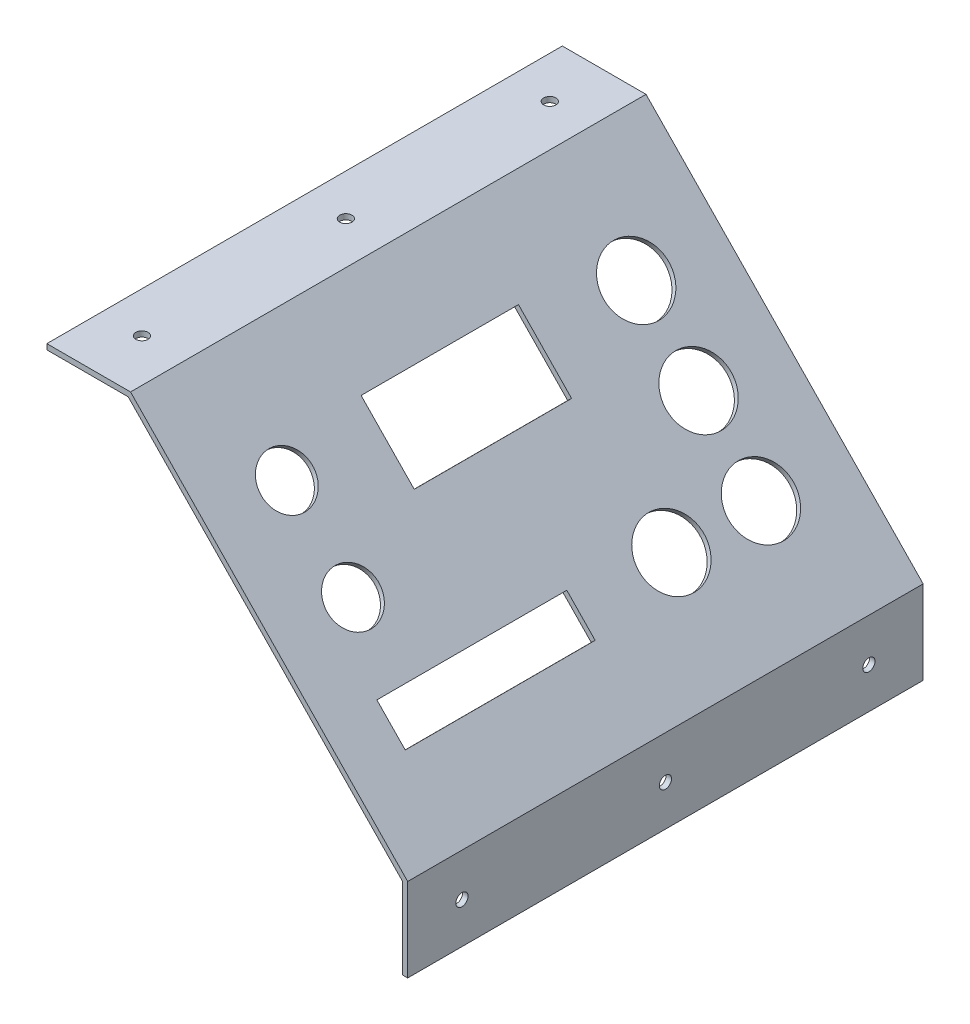
ISO-10303-21;
HEADER;
FILE_DESCRIPTION(('STEP AP214'),'2;1');
FILE_NAME('part.step','',(''),(''),'','','');
FILE_SCHEMA(('AUTOMOTIVE_DESIGN { 1 0 10303 214 1 1 1 1 }'));
ENDSEC;
DATA;
#1=APPLICATION_CONTEXT('core data for automotive mechanical design processes');
#2=APPLICATION_PROTOCOL_DEFINITION('international standard','automotive_design',2000,#1);
#3=PRODUCT_CONTEXT('',#1,'mechanical');
#4=PRODUCT('Part','Part','',(#3));
#5=PRODUCT_RELATED_PRODUCT_CATEGORY('part','',(#4));
#6=PRODUCT_DEFINITION_FORMATION('','',#4);
#7=PRODUCT_DEFINITION_CONTEXT('part definition',#1,'design');
#8=PRODUCT_DEFINITION('design','',#6,#7);
#9=PRODUCT_DEFINITION_SHAPE('','',#8);
#10=(LENGTH_UNIT() NAMED_UNIT(*) SI_UNIT(.MILLI.,.METRE.));
#11=(NAMED_UNIT(*) PLANE_ANGLE_UNIT() SI_UNIT($,.RADIAN.));
#12=(NAMED_UNIT(*) SI_UNIT($,.STERADIAN.) SOLID_ANGLE_UNIT());
#13=UNCERTAINTY_MEASURE_WITH_UNIT(LENGTH_MEASURE(1.E-05),#10,'distance_accuracy_value','');
#14=(GEOMETRIC_REPRESENTATION_CONTEXT(3) GLOBAL_UNCERTAINTY_ASSIGNED_CONTEXT((#13)) GLOBAL_UNIT_ASSIGNED_CONTEXT((#10,
#11,#12)) REPRESENTATION_CONTEXT('',''));
#15=CARTESIAN_POINT('',(0.,0.,0.));
#16=DIRECTION('',(0.,0.,1.));
#17=DIRECTION('',(1.,0.,0.));
#18=AXIS2_PLACEMENT_3D('',#15,#16,#17);
#19=CARTESIAN_POINT('',(-64.5,38.,95.));
#20=DIRECTION('',(0.,0.,1.));
#21=DIRECTION('',(1.,0.,0.));
#22=AXIS2_PLACEMENT_3D('',#19,#20,#21);
#23=PLANE('',#22);
#24=DIRECTION('',(1.,0.,0.));
#25=VECTOR('',#24,1.);
#26=CARTESIAN_POINT('',(-131.,104.,95.));
#27=LINE('',#26,#25);
#28=CARTESIAN_POINT('',(-131.,104.,95.));
#29=VERTEX_POINT('',#28);
#30=CARTESIAN_POINT('',(-101.,104.,95.));
#31=VERTEX_POINT('',#30);
#32=EDGE_CURVE('E10',#29,#31,#27,.T.);
#33=ORIENTED_EDGE('',*,*,#32,.T.);
#34=DIRECTION('',(0.696684280725865,-0.717377873222672,0.));
#35=VECTOR('',#34,1.);
#36=CARTESIAN_POINT('',(-101.,104.,95.));
#37=LINE('',#36,#35);
#38=CARTESIAN_POINT('',(0.,0.,95.));
#39=VERTEX_POINT('',#38);
#40=EDGE_CURVE('E295',#31,#39,#37,.T.);
#41=ORIENTED_EDGE('',*,*,#40,.T.);
#42=DIRECTION('',(0.,-1.,0.));
#43=VECTOR('',#42,1.);
#44=CARTESIAN_POINT('',(0.,0.,95.));
#45=LINE('',#44,#43);
#46=CARTESIAN_POINT('',(0.,-30.,95.));
#47=VERTEX_POINT('',#46);
#48=EDGE_CURVE('E334',#39,#47,#45,.T.);
#49=ORIENTED_EDGE('',*,*,#48,.T.);
#50=DIRECTION('',(1.,0.,0.));
#51=VECTOR('',#50,1.);
#52=CARTESIAN_POINT('',(0.,-30.,95.));
#53=LINE('',#52,#51);
#54=CARTESIAN_POINT('',(2.,-30.,95.));
#55=VERTEX_POINT('',#54);
#56=EDGE_CURVE('E335',#47,#55,#53,.T.);
#57=ORIENTED_EDGE('',*,*,#56,.T.);
#58=DIRECTION('',(0.,1.,0.));
#59=VECTOR('',#58,1.);
#60=CARTESIAN_POINT('',(2.,-30.,95.));
#61=LINE('',#60,#59);
#62=CARTESIAN_POINT('',(2.,0.811334874623189,95.));
#63=VERTEX_POINT('',#62);
#64=EDGE_CURVE('E436',#55,#63,#61,.T.);
#65=ORIENTED_EDGE('',*,*,#64,.T.);
#66=DIRECTION('',(-0.696684280725865,0.717377873222672,0.));
#67=VECTOR('',#66,1.);
#68=CARTESIAN_POINT('',(2.,0.811334874623189,95.));
#69=LINE('',#68,#67);
#70=CARTESIAN_POINT('',(-100.154376708299,106.,95.));
#71=VERTEX_POINT('',#70);
#72=EDGE_CURVE('E417',#63,#71,#69,.T.);
#73=ORIENTED_EDGE('',*,*,#72,.T.);
#74=DIRECTION('',(-1.,0.,0.));
#75=VECTOR('',#74,1.);
#76=CARTESIAN_POINT('',(-100.154376708299,106.,95.));
#77=LINE('',#76,#75);
#78=CARTESIAN_POINT('',(-131.,106.,95.));
#79=VERTEX_POINT('',#78);
#80=EDGE_CURVE('E343',#71,#79,#77,.T.);
#81=ORIENTED_EDGE('',*,*,#80,.T.);
#82=DIRECTION('',(0.,-1.,0.));
#83=VECTOR('',#82,1.);
#84=CARTESIAN_POINT('',(-131.,106.,95.));
#85=LINE('',#84,#83);
#86=EDGE_CURVE('E328',#79,#29,#85,.T.);
#87=ORIENTED_EDGE('',*,*,#86,.T.);
#88=EDGE_LOOP('',(#33,#41,#49,#57,#65,#73,#81,#87));
#89=FACE_BOUND('',#88,.T.);
#90=ADVANCED_FACE('F15',(#89),#23,.T.);
#91=CARTESIAN_POINT('',(-131.,104.,0.));
#92=DIRECTION('',(0.,-1.,0.));
#93=DIRECTION('',(0.,0.,-1.));
#94=AXIS2_PLACEMENT_3D('',#91,#92,#93);
#95=PLANE('',#94);
#96=CARTESIAN_POINT('',(-115.621694843186,104.,-75.));
#97=DIRECTION('',(0.,1.,0.));
#98=DIRECTION('',(1.,0.,0.));
#99=AXIS2_PLACEMENT_3D('',#96,#97,#98);
#100=CIRCLE('',#99,2.25);
#101=CARTESIAN_POINT('',(-117.871694843186,104.,-75.));
#102=VERTEX_POINT('',#101);
#103=EDGE_CURVE('E315',#102,#102,#100,.T.);
#104=ORIENTED_EDGE('',*,*,#103,.T.);
#105=EDGE_LOOP('',(#104));
#106=FACE_BOUND('',#105,.T.);
#107=CARTESIAN_POINT('',(-115.788594177075,104.,0.));
#108=DIRECTION('',(0.,1.,0.));
#109=DIRECTION('',(1.,0.,0.));
#110=AXIS2_PLACEMENT_3D('',#107,#108,#109);
#111=CIRCLE('',#110,2.25);
#112=CARTESIAN_POINT('',(-118.038594177075,104.,0.));
#113=VERTEX_POINT('',#112);
#114=EDGE_CURVE('E355',#113,#113,#111,.T.);
#115=ORIENTED_EDGE('',*,*,#114,.T.);
#116=EDGE_LOOP('',(#115));
#117=FACE_BOUND('',#116,.T.);
#118=CARTESIAN_POINT('',(-115.955493510963,104.,75.));
#119=DIRECTION('',(0.,1.,0.));
#120=DIRECTION('',(1.,0.,0.));
#121=AXIS2_PLACEMENT_3D('',#118,#119,#120);
#122=CIRCLE('',#121,2.25);
#123=CARTESIAN_POINT('',(-118.205493510963,104.,75.));
#124=VERTEX_POINT('',#123);
#125=EDGE_CURVE('E310',#124,#124,#122,.T.);
#126=ORIENTED_EDGE('',*,*,#125,.T.);
#127=EDGE_LOOP('',(#126));
#128=FACE_BOUND('',#127,.T.);
#129=DIRECTION('',(0.,0.,1.));
#130=VECTOR('',#129,1.);
#131=CARTESIAN_POINT('',(-101.,104.,0.));
#132=LINE('',#131,#130);
#133=CARTESIAN_POINT('',(-101.,104.,-95.));
#134=VERTEX_POINT('',#133);
#135=EDGE_CURVE('E26',#134,#31,#132,.T.);
#136=ORIENTED_EDGE('',*,*,#135,.T.);
#137=ORIENTED_EDGE('',*,*,#32,.F.);
#138=DIRECTION('',(0.,0.,-1.));
#139=VECTOR('',#138,1.);
#140=CARTESIAN_POINT('',(-131.,104.,0.));
#141=LINE('',#140,#139);
#142=CARTESIAN_POINT('',(-131.,104.,-95.));
#143=VERTEX_POINT('',#142);
#144=EDGE_CURVE('E325',#29,#143,#141,.T.);
#145=ORIENTED_EDGE('',*,*,#144,.T.);
#146=DIRECTION('',(-1.,0.,0.));
#147=VECTOR('',#146,1.);
#148=CARTESIAN_POINT('',(-131.,104.,-95.));
#149=LINE('',#148,#147);
#150=EDGE_CURVE('E271',#134,#143,#149,.T.);
#151=ORIENTED_EDGE('',*,*,#150,.F.);
#152=EDGE_LOOP('',(#136,#137,#145,#151));
#153=FACE_BOUND('',#152,.T.);
#154=ADVANCED_FACE('F850',(#106,#117,#128,#153),#95,.T.);
#155=CARTESIAN_POINT('',(-101.,104.,0.));
#156=DIRECTION('',(-0.717377873222672,-0.696684280725865,0.));
#157=DIRECTION('',(-0.696684280725865,0.717377873222672,0.));
#158=AXIS2_PLACEMENT_3D('',#155,#156,#157);
#159=PLANE('',#158);
#160=CARTESIAN_POINT('',(-27.2268850731615,28.0356044317703,-30.0000000002443));
#161=DIRECTION('',(0.717377873222672,0.696684280725865,0.));
#162=DIRECTION('',(0.,0.,-1.));
#163=AXIS2_PLACEMENT_3D('',#160,#161,#162);
#164=CIRCLE('',#163,12.);
#165=CARTESIAN_POINT('',(-27.2268850731615,28.0356044317703,-18.0000000002443));
#166=VERTEX_POINT('',#165);
#167=EDGE_CURVE('E306',#166,#166,#164,.T.);
#168=ORIENTED_EDGE('',*,*,#167,.T.);
#169=EDGE_LOOP('',(#168));
#170=FACE_BOUND('',#169,.T.);
#171=DIRECTION('',(-0.696684280725865,0.717377873222672,0.));
#172=VECTOR('',#171,1.);
#173=CARTESIAN_POINT('',(-90.549735789112,93.2393319016599,-26.5));
#174=LINE('',#173,#172);
#175=CARTESIAN_POINT('',(-60.5226432898273,62.3203455657627,-26.5));
#176=VERTEX_POINT('',#175);
#177=CARTESIAN_POINT('',(-80.0994715782241,82.4786638033198,-26.5));
#178=VERTEX_POINT('',#177);
#179=EDGE_CURVE('E344',#176,#178,#174,.T.);
#180=ORIENTED_EDGE('',*,*,#179,.T.);
#181=DIRECTION('',(0.,0.,1.));
#182=VECTOR('',#181,1.);
#183=CARTESIAN_POINT('',(-80.0994715782241,82.4786638033198,15.75));
#184=LINE('',#183,#182);
#185=CARTESIAN_POINT('',(-80.0994715782241,82.4786638033198,31.5));
#186=VERTEX_POINT('',#185);
#187=EDGE_CURVE('E390',#178,#186,#184,.T.);
#188=ORIENTED_EDGE('',*,*,#187,.T.);
#189=DIRECTION('',(0.696684280725865,-0.717377873222672,0.));
#190=VECTOR('',#189,1.);
#191=CARTESIAN_POINT('',(-80.7613216449136,83.1601727828814,31.5));
#192=LINE('',#191,#190);
#193=CARTESIAN_POINT('',(-60.5226432898273,62.3203455657627,31.5));
#194=VERTEX_POINT('',#193);
#195=EDGE_CURVE('E371',#186,#194,#192,.T.);
#196=ORIENTED_EDGE('',*,*,#195,.T.);
#197=DIRECTION('',(0.,0.,-1.));
#198=VECTOR('',#197,1.);
#199=CARTESIAN_POINT('',(-60.5226432898273,62.3203455657627,-13.25));
#200=LINE('',#199,#198);
#201=EDGE_CURVE('E360',#194,#176,#200,.T.);
#202=ORIENTED_EDGE('',*,*,#201,.T.);
#203=EDGE_LOOP('',(#180,#188,#196,#202));
#204=FACE_BOUND('',#203,.T.);
#205=CARTESIAN_POINT('',(-27.2267966092691,28.0355133402375,-63.));
#206=DIRECTION('',(0.717377873222672,0.696684280725865,0.));
#207=DIRECTION('',(0.,0.,-1.));
#208=AXIS2_PLACEMENT_3D('',#205,#206,#207);
#209=CIRCLE('',#208,12.);
#210=CARTESIAN_POINT('',(-27.2267966092691,28.0355133402375,-51.));
#211=VERTEX_POINT('',#210);
#212=EDGE_CURVE('E406',#211,#211,#209,.T.);
#213=ORIENTED_EDGE('',*,*,#212,.T.);
#214=EDGE_LOOP('',(#213));
#215=FACE_BOUND('',#214,.T.);
#216=CARTESIAN_POINT('',(-73.4809709113283,75.6635740077044,65.5));
#217=DIRECTION('',(0.717377873222672,0.696684280725865,0.));
#218=DIRECTION('',(0.,0.,-1.));
#219=AXIS2_PLACEMENT_3D('',#216,#217,#218);
#220=CIRCLE('',#219,9.5);
#221=CARTESIAN_POINT('',(-73.4809709113283,75.6635740077044,75.));
#222=VERTEX_POINT('',#221);
#223=EDGE_CURVE('E415',#222,#222,#220,.T.);
#224=ORIENTED_EDGE('',*,*,#223,.T.);
#225=EDGE_LOOP('',(#224));
#226=FACE_BOUND('',#225,.T.);
#227=DIRECTION('',(-0.696684280725865,0.717377873222672,0.));
#228=VECTOR('',#227,1.);
#229=CARTESIAN_POINT('',(-65.8927741895546,67.8499853040958,5.));
#230=LINE('',#229,#228);
#231=CARTESIAN_POINT('',(-20.3352841682213,20.9393025098516,5.));
#232=VERTEX_POINT('',#231);
#233=CARTESIAN_POINT('',(-30.7855483791092,31.6999706081917,5.));
#234=VERTEX_POINT('',#233);
#235=EDGE_CURVE('E445',#232,#234,#230,.T.);
#236=ORIENTED_EDGE('',*,*,#235,.T.);
#237=DIRECTION('',(0.,0.,1.));
#238=VECTOR('',#237,1.);
#239=CARTESIAN_POINT('',(-30.7855483791092,31.6999706081917,37.5));
#240=LINE('',#239,#238);
#241=CARTESIAN_POINT('',(-30.7855483791092,31.6999706081917,75.));
#242=VERTEX_POINT('',#241);
#243=EDGE_CURVE('E219',#234,#242,#240,.T.);
#244=ORIENTED_EDGE('',*,*,#243,.T.);
#245=DIRECTION('',(0.696684280725865,-0.717377873222672,0.));
#246=VECTOR('',#245,1.);
#247=CARTESIAN_POINT('',(-60.6676420841106,62.4696512549258,75.));
#248=LINE('',#247,#246);
#249=CARTESIAN_POINT('',(-20.3352841682213,20.9393025098516,75.));
#250=VERTEX_POINT('',#249);
#251=EDGE_CURVE('E338',#242,#250,#248,.T.);
#252=ORIENTED_EDGE('',*,*,#251,.T.);
#253=DIRECTION('',(0.,0.,-1.));
#254=VECTOR('',#253,1.);
#255=CARTESIAN_POINT('',(-20.3352841682213,20.9393025098516,2.5));
#256=LINE('',#255,#254);
#257=EDGE_CURVE('E374',#250,#232,#256,.T.);
#258=ORIENTED_EDGE('',*,*,#257,.T.);
#259=EDGE_LOOP('',(#236,#244,#252,#258));
#260=FACE_BOUND('',#259,.T.);
#261=CARTESIAN_POINT('',(-73.2079591371762,75.3824529729339,-63.));
#262=DIRECTION('',(0.717377873222672,0.696684280725865,0.));
#263=DIRECTION('',(0.,0.,-1.));
#264=AXIS2_PLACEMENT_3D('',#261,#262,#263);
#265=CIRCLE('',#264,12.);
#266=CARTESIAN_POINT('',(-73.2079591371762,75.3824529729339,-51.));
#267=VERTEX_POINT('',#266);
#268=EDGE_CURVE('E398',#267,#267,#265,.T.);
#269=ORIENTED_EDGE('',*,*,#268,.T.);
#270=EDGE_LOOP('',(#269));
#271=FACE_BOUND('',#270,.T.);
#272=CARTESIAN_POINT('',(-50.2173778732227,51.7089831565857,-63.));
#273=DIRECTION('',(0.717377873222672,0.696684280725865,0.));
#274=DIRECTION('',(0.,0.,-1.));
#275=AXIS2_PLACEMENT_3D('',#272,#273,#274);
#276=CIRCLE('',#275,12.);
#277=CARTESIAN_POINT('',(-50.2173778732227,51.7089831565857,-51.));
#278=VERTEX_POINT('',#277);
#279=EDGE_CURVE('E19',#278,#278,#276,.T.);
#280=ORIENTED_EDGE('',*,*,#279,.T.);
#281=EDGE_LOOP('',(#280));
#282=FACE_BOUND('',#281,.T.);
#283=CARTESIAN_POINT('',(-49.0970210859231,50.5553484449109,65.5));
#284=DIRECTION('',(0.717377873222672,0.696684280725865,0.));
#285=DIRECTION('',(0.,0.,-1.));
#286=AXIS2_PLACEMENT_3D('',#283,#284,#285);
#287=CIRCLE('',#286,9.5);
#288=CARTESIAN_POINT('',(-49.0970210859231,50.5553484449109,75.));
#289=VERTEX_POINT('',#288);
#290=EDGE_CURVE('E381',#289,#289,#287,.T.);
#291=ORIENTED_EDGE('',*,*,#290,.T.);
#292=EDGE_LOOP('',(#291));
#293=FACE_BOUND('',#292,.T.);
#294=DIRECTION('',(0.,0.,1.));
#295=VECTOR('',#294,1.);
#296=CARTESIAN_POINT('',(0.,0.,0.));
#297=LINE('',#296,#295);
#298=CARTESIAN_POINT('',(0.,0.,-95.));
#299=VERTEX_POINT('',#298);
#300=EDGE_CURVE('E427',#299,#39,#297,.T.);
#301=ORIENTED_EDGE('',*,*,#300,.T.);
#302=ORIENTED_EDGE('',*,*,#40,.F.);
#303=ORIENTED_EDGE('',*,*,#135,.F.);
#304=DIRECTION('',(-0.696684280725865,0.717377873222672,0.));
#305=VECTOR('',#304,1.);
#306=CARTESIAN_POINT('',(-101.,104.,-95.));
#307=LINE('',#306,#305);
#308=EDGE_CURVE('E329',#299,#134,#307,.T.);
#309=ORIENTED_EDGE('',*,*,#308,.F.);
#310=EDGE_LOOP('',(#301,#302,#303,#309));
#311=FACE_BOUND('',#310,.T.);
#312=ADVANCED_FACE('F824',(#170,#204,#215,#226,#260,#271,#282,#293,#311),#159,.T.);
#313=CARTESIAN_POINT('',(0.,0.,0.));
#314=DIRECTION('',(-1.,0.,0.));
#315=DIRECTION('',(0.,0.,1.));
#316=AXIS2_PLACEMENT_3D('',#313,#314,#315);
#317=PLANE('',#316);
#318=CARTESIAN_POINT('',(0.,-15.,-75.));
#319=DIRECTION('',(1.,0.,0.));
#320=DIRECTION('',(0.,0.,1.));
#321=AXIS2_PLACEMENT_3D('',#318,#319,#320);
#322=CIRCLE('',#321,2.25);
#323=CARTESIAN_POINT('',(0.,-15.,-77.25));
#324=VERTEX_POINT('',#323);
#325=EDGE_CURVE('E281',#324,#324,#322,.T.);
#326=ORIENTED_EDGE('',*,*,#325,.T.);
#327=EDGE_LOOP('',(#326));
#328=FACE_BOUND('',#327,.T.);
#329=CARTESIAN_POINT('',(0.,-15.,0.));
#330=DIRECTION('',(1.,0.,0.));
#331=DIRECTION('',(0.,0.,1.));
#332=AXIS2_PLACEMENT_3D('',#329,#330,#331);
#333=CIRCLE('',#332,2.25);
#334=CARTESIAN_POINT('',(0.,-15.,-2.25));
#335=VERTEX_POINT('',#334);
#336=EDGE_CURVE('E431',#335,#335,#333,.T.);
#337=ORIENTED_EDGE('',*,*,#336,.T.);
#338=EDGE_LOOP('',(#337));
#339=FACE_BOUND('',#338,.T.);
#340=CARTESIAN_POINT('',(0.,-15.,75.));
#341=DIRECTION('',(1.,0.,0.));
#342=DIRECTION('',(0.,0.,1.));
#343=AXIS2_PLACEMENT_3D('',#340,#341,#342);
#344=CIRCLE('',#343,2.25);
#345=CARTESIAN_POINT('',(0.,-15.,72.75));
#346=VERTEX_POINT('',#345);
#347=EDGE_CURVE('E440',#346,#346,#344,.T.);
#348=ORIENTED_EDGE('',*,*,#347,.T.);
#349=EDGE_LOOP('',(#348));
#350=FACE_BOUND('',#349,.T.);
#351=DIRECTION('',(0.,0.,1.));
#352=VECTOR('',#351,1.);
#353=CARTESIAN_POINT('',(0.,-30.,0.));
#354=LINE('',#353,#352);
#355=CARTESIAN_POINT('',(0.,-30.,-95.));
#356=VERTEX_POINT('',#355);
#357=EDGE_CURVE('E330',#356,#47,#354,.T.);
#358=ORIENTED_EDGE('',*,*,#357,.T.);
#359=ORIENTED_EDGE('',*,*,#48,.F.);
#360=ORIENTED_EDGE('',*,*,#300,.F.);
#361=DIRECTION('',(0.,1.,0.));
#362=VECTOR('',#361,1.);
#363=CARTESIAN_POINT('',(0.,0.,-95.));
#364=LINE('',#363,#362);
#365=EDGE_CURVE('E385',#356,#299,#364,.T.);
#366=ORIENTED_EDGE('',*,*,#365,.F.);
#367=EDGE_LOOP('',(#358,#359,#360,#366));
#368=FACE_BOUND('',#367,.T.);
#369=ADVANCED_FACE('F827',(#328,#339,#350,#368),#317,.T.);
#370=CARTESIAN_POINT('',(0.,-30.,0.));
#371=DIRECTION('',(0.,-1.,0.));
#372=DIRECTION('',(0.,0.,-1.));
#373=AXIS2_PLACEMENT_3D('',#370,#371,#372);
#374=PLANE('',#373);
#375=DIRECTION('',(0.,0.,1.));
#376=VECTOR('',#375,1.);
#377=CARTESIAN_POINT('',(2.,-30.,0.));
#378=LINE('',#377,#376);
#379=CARTESIAN_POINT('',(2.,-30.,-95.));
#380=VERTEX_POINT('',#379);
#381=EDGE_CURVE('E452',#380,#55,#378,.T.);
#382=ORIENTED_EDGE('',*,*,#381,.T.);
#383=ORIENTED_EDGE('',*,*,#56,.F.);
#384=ORIENTED_EDGE('',*,*,#357,.F.);
#385=DIRECTION('',(-1.,0.,0.));
#386=VECTOR('',#385,1.);
#387=CARTESIAN_POINT('',(0.,-30.,-95.));
#388=LINE('',#387,#386);
#389=EDGE_CURVE('E291',#380,#356,#388,.T.);
#390=ORIENTED_EDGE('',*,*,#389,.F.);
#391=EDGE_LOOP('',(#382,#383,#384,#390));
#392=FACE_BOUND('',#391,.T.);
#393=ADVANCED_FACE('F831',(#392),#374,.T.);
#394=CARTESIAN_POINT('',(2.,-30.,0.));
#395=DIRECTION('',(1.,0.,0.));
#396=DIRECTION('',(0.,1.,0.));
#397=AXIS2_PLACEMENT_3D('',#394,#395,#396);
#398=PLANE('',#397);
#399=CARTESIAN_POINT('',(2.,-15.,-75.));
#400=DIRECTION('',(-1.,0.,0.));
#401=DIRECTION('',(0.,0.,1.));
#402=AXIS2_PLACEMENT_3D('',#399,#400,#401);
#403=CIRCLE('',#402,2.25);
#404=CARTESIAN_POINT('',(2.,-15.,-77.25));
#405=VERTEX_POINT('',#404);
#406=EDGE_CURVE('E267',#405,#405,#403,.T.);
#407=ORIENTED_EDGE('',*,*,#406,.T.);
#408=EDGE_LOOP('',(#407));
#409=FACE_BOUND('',#408,.T.);
#410=CARTESIAN_POINT('',(2.,-15.,0.));
#411=DIRECTION('',(-1.,0.,0.));
#412=DIRECTION('',(0.,0.,1.));
#413=AXIS2_PLACEMENT_3D('',#410,#411,#412);
#414=CIRCLE('',#413,2.25);
#415=CARTESIAN_POINT('',(2.,-15.,-2.25));
#416=VERTEX_POINT('',#415);
#417=EDGE_CURVE('E324',#416,#416,#414,.T.);
#418=ORIENTED_EDGE('',*,*,#417,.T.);
#419=EDGE_LOOP('',(#418));
#420=FACE_BOUND('',#419,.T.);
#421=CARTESIAN_POINT('',(2.,-15.,75.));
#422=DIRECTION('',(-1.,0.,0.));
#423=DIRECTION('',(0.,0.,1.));
#424=AXIS2_PLACEMENT_3D('',#421,#422,#423);
#425=CIRCLE('',#424,2.25);
#426=CARTESIAN_POINT('',(2.,-15.,72.75));
#427=VERTEX_POINT('',#426);
#428=EDGE_CURVE('E428',#427,#427,#425,.T.);
#429=ORIENTED_EDGE('',*,*,#428,.T.);
#430=EDGE_LOOP('',(#429));
#431=FACE_BOUND('',#430,.T.);
#432=DIRECTION('',(0.,0.,1.));
#433=VECTOR('',#432,1.);
#434=CARTESIAN_POINT('',(2.,0.81133487462318,0.));
#435=LINE('',#434,#433);
#436=CARTESIAN_POINT('',(2.,0.811334874623189,-95.));
#437=VERTEX_POINT('',#436);
#438=EDGE_CURVE('E420',#437,#63,#435,.T.);
#439=ORIENTED_EDGE('',*,*,#438,.T.);
#440=ORIENTED_EDGE('',*,*,#64,.F.);
#441=ORIENTED_EDGE('',*,*,#381,.F.);
#442=DIRECTION('',(0.,-1.,0.));
#443=VECTOR('',#442,1.);
#444=CARTESIAN_POINT('',(2.,-30.,-95.));
#445=LINE('',#444,#443);
#446=EDGE_CURVE('E287',#437,#380,#445,.T.);
#447=ORIENTED_EDGE('',*,*,#446,.F.);
#448=EDGE_LOOP('',(#439,#440,#441,#447));
#449=FACE_BOUND('',#448,.T.);
#450=ADVANCED_FACE('F268',(#409,#420,#431,#449),#398,.T.);
#451=CARTESIAN_POINT('',(2.,0.81133487462318,0.));
#452=DIRECTION('',(0.717377873222672,0.696684280725865,0.));
#453=DIRECTION('',(0.,0.,-1.));
#454=AXIS2_PLACEMENT_3D('',#451,#452,#453);
#455=PLANE('',#454);
#456=CARTESIAN_POINT('',(-25.7921293267162,29.428972993222,-30.0000000002443));
#457=DIRECTION('',(-0.717377873222672,-0.696684280725865,0.));
#458=DIRECTION('',(0.,0.,-1.));
#459=AXIS2_PLACEMENT_3D('',#456,#457,#458);
#460=CIRCLE('',#459,12.);
#461=CARTESIAN_POINT('',(-25.7921293267162,29.428972993222,-18.0000000002443));
#462=VERTEX_POINT('',#461);
#463=EDGE_CURVE('E389',#462,#462,#460,.T.);
#464=ORIENTED_EDGE('',*,*,#463,.T.);
#465=EDGE_LOOP('',(#464));
#466=FACE_BOUND('',#465,.T.);
#467=DIRECTION('',(0.696684280725865,-0.717377873222672,0.));
#468=VECTOR('',#467,1.);
#469=CARTESIAN_POINT('',(-38.3323579158893,42.3416836196974,-26.5));
#470=LINE('',#469,#468);
#471=CARTESIAN_POINT('',(-78.6647158317787,83.8720323647716,-26.5));
#472=VERTEX_POINT('',#471);
#473=CARTESIAN_POINT('',(-59.0878875433819,63.7137141272145,-26.5));
#474=VERTEX_POINT('',#473);
#475=EDGE_CURVE('E285',#472,#474,#470,.T.);
#476=ORIENTED_EDGE('',*,*,#475,.T.);
#477=DIRECTION('',(0.,0.,1.));
#478=VECTOR('',#477,1.);
#479=CARTESIAN_POINT('',(-59.0878875433819,63.7137141272145,-13.25));
#480=LINE('',#479,#478);
#481=CARTESIAN_POINT('',(-59.0878875433819,63.7137141272145,31.5));
#482=VERTEX_POINT('',#481);
#483=EDGE_CURVE('E515',#474,#482,#480,.T.);
#484=ORIENTED_EDGE('',*,*,#483,.T.);
#485=DIRECTION('',(-0.696684280725865,0.717377873222672,0.));
#486=VECTOR('',#485,1.);
#487=CARTESIAN_POINT('',(-28.543943771691,32.2625245009188,31.5));
#488=LINE('',#487,#486);
#489=CARTESIAN_POINT('',(-78.6647158317787,83.8720323647716,31.5));
#490=VERTEX_POINT('',#489);
#491=EDGE_CURVE('E361',#482,#490,#488,.T.);
#492=ORIENTED_EDGE('',*,*,#491,.T.);
#493=DIRECTION('',(0.,0.,-1.));
#494=VECTOR('',#493,1.);
#495=CARTESIAN_POINT('',(-78.6647158317787,83.8720323647716,15.75));
#496=LINE('',#495,#494);
#497=EDGE_CURVE('E386',#490,#472,#496,.T.);
#498=ORIENTED_EDGE('',*,*,#497,.T.);
#499=EDGE_LOOP('',(#476,#484,#492,#498));
#500=FACE_BOUND('',#499,.T.);
#501=CARTESIAN_POINT('',(-25.7920408628238,29.4288819016893,-63.));
#502=DIRECTION('',(-0.717377873222672,-0.696684280725865,0.));
#503=DIRECTION('',(0.,0.,-1.));
#504=AXIS2_PLACEMENT_3D('',#501,#502,#503);
#505=CIRCLE('',#504,12.);
#506=CARTESIAN_POINT('',(-25.7920408628238,29.4288819016893,-51.));
#507=VERTEX_POINT('',#506);
#508=EDGE_CURVE('E407',#507,#507,#505,.T.);
#509=ORIENTED_EDGE('',*,*,#508,.T.);
#510=EDGE_LOOP('',(#509));
#511=FACE_BOUND('',#510,.T.);
#512=CARTESIAN_POINT('',(-72.046215164883,77.0569425691561,65.5));
#513=DIRECTION('',(-0.717377873222672,-0.696684280725865,0.));
#514=DIRECTION('',(0.,0.,-1.));
#515=AXIS2_PLACEMENT_3D('',#512,#513,#514);
#516=CIRCLE('',#515,9.5);
#517=CARTESIAN_POINT('',(-72.046215164883,77.0569425691561,75.));
#518=VERTEX_POINT('',#517);
#519=EDGE_CURVE('E416',#518,#518,#516,.T.);
#520=ORIENTED_EDGE('',*,*,#519,.T.);
#521=EDGE_LOOP('',(#520));
#522=FACE_BOUND('',#521,.T.);
#523=DIRECTION('',(0.696684280725865,-0.717377873222672,0.));
#524=VECTOR('',#523,1.);
#525=CARTESIAN_POINT('',(-13.6753963163319,16.9523370221333,5.));
#526=LINE('',#525,#524);
#527=CARTESIAN_POINT('',(-29.3507926326639,33.0933391696434,5.));
#528=VERTEX_POINT('',#527);
#529=CARTESIAN_POINT('',(-18.9005284217759,22.3326710713033,5.));
#530=VERTEX_POINT('',#529);
#531=EDGE_CURVE('E394',#528,#530,#526,.T.);
#532=ORIENTED_EDGE('',*,*,#531,.T.);
#533=DIRECTION('',(0.,0.,1.));
#534=VECTOR('',#533,1.);
#535=CARTESIAN_POINT('',(-18.9005284217759,22.3326710713033,2.5));
#536=LINE('',#535,#534);
#537=CARTESIAN_POINT('',(-18.9005284217759,22.3326710713033,75.));
#538=VERTEX_POINT('',#537);
#539=EDGE_CURVE('E538',#530,#538,#536,.T.);
#540=ORIENTED_EDGE('',*,*,#539,.T.);
#541=DIRECTION('',(-0.696684280725865,0.717377873222672,0.));
#542=VECTOR('',#541,1.);
#543=CARTESIAN_POINT('',(-8.45026421088796,11.5720029729633,75.));
#544=LINE('',#543,#542);
#545=CARTESIAN_POINT('',(-29.3507926326639,33.0933391696434,75.));
#546=VERTEX_POINT('',#545);
#547=EDGE_CURVE('E301',#538,#546,#544,.T.);
#548=ORIENTED_EDGE('',*,*,#547,.T.);
#549=DIRECTION('',(0.,0.,-1.));
#550=VECTOR('',#549,1.);
#551=CARTESIAN_POINT('',(-29.3507926326639,33.0933391696434,37.5));
#552=LINE('',#551,#550);
#553=EDGE_CURVE('E205',#546,#528,#552,.T.);
#554=ORIENTED_EDGE('',*,*,#553,.T.);
#555=EDGE_LOOP('',(#532,#540,#548,#554));
#556=FACE_BOUND('',#555,.T.);
#557=CARTESIAN_POINT('',(-71.7732033907309,76.7758215343857,-63.));
#558=DIRECTION('',(-0.717377873222672,-0.696684280725865,0.));
#559=DIRECTION('',(0.,0.,-1.));
#560=AXIS2_PLACEMENT_3D('',#557,#558,#559);
#561=CIRCLE('',#560,12.);
#562=CARTESIAN_POINT('',(-71.7732033907309,76.7758215343857,-51.));
#563=VERTEX_POINT('',#562);
#564=EDGE_CURVE('E488',#563,#563,#561,.T.);
#565=ORIENTED_EDGE('',*,*,#564,.T.);
#566=EDGE_LOOP('',(#565));
#567=FACE_BOUND('',#566,.T.);
#568=CARTESIAN_POINT('',(-48.7826221267773,53.1023517180375,-63.));
#569=DIRECTION('',(-0.717377873222672,-0.696684280725865,0.));
#570=DIRECTION('',(0.,0.,-1.));
#571=AXIS2_PLACEMENT_3D('',#568,#569,#570);
#572=CIRCLE('',#571,12.);
#573=CARTESIAN_POINT('',(-48.7826221267773,53.1023517180375,-51.));
#574=VERTEX_POINT('',#573);
#575=EDGE_CURVE('E376',#574,#574,#572,.T.);
#576=ORIENTED_EDGE('',*,*,#575,.T.);
#577=EDGE_LOOP('',(#576));
#578=FACE_BOUND('',#577,.T.);
#579=CARTESIAN_POINT('',(-47.6622653394777,51.9487170063626,65.5));
#580=DIRECTION('',(-0.717377873222672,-0.696684280725865,0.));
#581=DIRECTION('',(0.,0.,-1.));
#582=AXIS2_PLACEMENT_3D('',#579,#580,#581);
#583=CIRCLE('',#582,9.5);
#584=CARTESIAN_POINT('',(-47.6622653394777,51.9487170063626,75.));
#585=VERTEX_POINT('',#584);
#586=EDGE_CURVE('E296',#585,#585,#583,.T.);
#587=ORIENTED_EDGE('',*,*,#586,.T.);
#588=EDGE_LOOP('',(#587));
#589=FACE_BOUND('',#588,.T.);
#590=DIRECTION('',(0.,0.,1.));
#591=VECTOR('',#590,1.);
#592=CARTESIAN_POINT('',(-100.154376708299,106.,0.));
#593=LINE('',#592,#591);
#594=CARTESIAN_POINT('',(-100.154376708299,106.,-95.));
#595=VERTEX_POINT('',#594);
#596=EDGE_CURVE('E421',#595,#71,#593,.T.);
#597=ORIENTED_EDGE('',*,*,#596,.T.);
#598=ORIENTED_EDGE('',*,*,#72,.F.);
#599=ORIENTED_EDGE('',*,*,#438,.F.);
#600=DIRECTION('',(0.696684280725865,-0.717377873222672,0.));
#601=VECTOR('',#600,1.);
#602=CARTESIAN_POINT('',(2.,0.811334874623189,-95.));
#603=LINE('',#602,#601);
#604=EDGE_CURVE('E292',#595,#437,#603,.T.);
#605=ORIENTED_EDGE('',*,*,#604,.F.);
#606=EDGE_LOOP('',(#597,#598,#599,#605));
#607=FACE_BOUND('',#606,.T.);
#608=ADVANCED_FACE('F838',(#466,#500,#511,#522,#556,#567,#578,#589,#607),#455,.T.);
#609=CARTESIAN_POINT('',(-100.154376708299,106.,0.));
#610=DIRECTION('',(0.,1.,0.));
#611=DIRECTION('',(1.,0.,0.));
#612=AXIS2_PLACEMENT_3D('',#609,#610,#611);
#613=PLANE('',#612);
#614=CARTESIAN_POINT('',(-115.621694843186,106.,-75.));
#615=DIRECTION('',(0.,-1.,0.));
#616=DIRECTION('',(1.,0.,0.));
#617=AXIS2_PLACEMENT_3D('',#614,#615,#616);
#618=CIRCLE('',#617,2.25);
#619=CARTESIAN_POINT('',(-117.871694843186,106.,-75.));
#620=VERTEX_POINT('',#619);
#621=EDGE_CURVE('E321',#620,#620,#618,.T.);
#622=ORIENTED_EDGE('',*,*,#621,.T.);
#623=EDGE_LOOP('',(#622));
#624=FACE_BOUND('',#623,.T.);
#625=CARTESIAN_POINT('',(-115.788594177075,106.,0.));
#626=DIRECTION('',(0.,-1.,0.));
#627=DIRECTION('',(1.,0.,0.));
#628=AXIS2_PLACEMENT_3D('',#625,#626,#627);
#629=CIRCLE('',#628,2.25);
#630=CARTESIAN_POINT('',(-118.038594177075,106.,0.));
#631=VERTEX_POINT('',#630);
#632=EDGE_CURVE('E312',#631,#631,#629,.T.);
#633=ORIENTED_EDGE('',*,*,#632,.T.);
#634=EDGE_LOOP('',(#633));
#635=FACE_BOUND('',#634,.T.);
#636=CARTESIAN_POINT('',(-115.955493510963,106.,75.));
#637=DIRECTION('',(0.,-1.,0.));
#638=DIRECTION('',(1.,0.,0.));
#639=AXIS2_PLACEMENT_3D('',#636,#637,#638);
#640=CIRCLE('',#639,2.25);
#641=CARTESIAN_POINT('',(-118.205493510963,106.,75.));
#642=VERTEX_POINT('',#641);
#643=EDGE_CURVE('E460',#642,#642,#640,.T.);
#644=ORIENTED_EDGE('',*,*,#643,.T.);
#645=EDGE_LOOP('',(#644));
#646=FACE_BOUND('',#645,.T.);
#647=DIRECTION('',(0.,0.,1.));
#648=VECTOR('',#647,1.);
#649=CARTESIAN_POINT('',(-131.,106.,0.));
#650=LINE('',#649,#648);
#651=CARTESIAN_POINT('',(-131.,106.,-95.));
#652=VERTEX_POINT('',#651);
#653=EDGE_CURVE('E339',#652,#79,#650,.T.);
#654=ORIENTED_EDGE('',*,*,#653,.T.);
#655=ORIENTED_EDGE('',*,*,#80,.F.);
#656=ORIENTED_EDGE('',*,*,#596,.F.);
#657=DIRECTION('',(1.,0.,0.));
#658=VECTOR('',#657,1.);
#659=CARTESIAN_POINT('',(-100.154376708299,106.,-95.));
#660=LINE('',#659,#658);
#661=EDGE_CURVE('E444',#652,#595,#660,.T.);
#662=ORIENTED_EDGE('',*,*,#661,.F.);
#663=EDGE_LOOP('',(#654,#655,#656,#662));
#664=FACE_BOUND('',#663,.T.);
#665=ADVANCED_FACE('F842',(#624,#635,#646,#664),#613,.T.);
#666=CARTESIAN_POINT('',(-131.,106.,0.));
#667=DIRECTION('',(-1.,0.,0.));
#668=DIRECTION('',(0.,0.,1.));
#669=AXIS2_PLACEMENT_3D('',#666,#667,#668);
#670=PLANE('',#669);
#671=ORIENTED_EDGE('',*,*,#144,.F.);
#672=ORIENTED_EDGE('',*,*,#86,.F.);
#673=ORIENTED_EDGE('',*,*,#653,.F.);
#674=DIRECTION('',(0.,1.,0.));
#675=VECTOR('',#674,1.);
#676=CARTESIAN_POINT('',(-131.,106.,-95.));
#677=LINE('',#676,#675);
#678=EDGE_CURVE('E279',#143,#652,#677,.T.);
#679=ORIENTED_EDGE('',*,*,#678,.F.);
#680=EDGE_LOOP('',(#671,#672,#673,#679));
#681=FACE_BOUND('',#680,.T.);
#682=ADVANCED_FACE('F847',(#681),#670,.T.);
#683=CARTESIAN_POINT('',(-64.5,38.,-95.));
#684=DIRECTION('',(0.,0.,-1.));
#685=DIRECTION('',(0.,-1.,0.));
#686=AXIS2_PLACEMENT_3D('',#683,#684,#685);
#687=PLANE('',#686);
#688=ORIENTED_EDGE('',*,*,#150,.T.);
#689=ORIENTED_EDGE('',*,*,#678,.T.);
#690=ORIENTED_EDGE('',*,*,#661,.T.);
#691=ORIENTED_EDGE('',*,*,#604,.T.);
#692=ORIENTED_EDGE('',*,*,#446,.T.);
#693=ORIENTED_EDGE('',*,*,#389,.T.);
#694=ORIENTED_EDGE('',*,*,#365,.T.);
#695=ORIENTED_EDGE('',*,*,#308,.T.);
#696=EDGE_LOOP('',(#688,#689,#690,#691,#692,#693,#694,#695));
#697=FACE_BOUND('',#696,.T.);
#698=ADVANCED_FACE('F852',(#697),#687,.T.);
#699=CARTESIAN_POINT('',(0.,-15.,-75.));
#700=DIRECTION('',(1.,0.,0.));
#701=DIRECTION('',(0.,0.,1.));
#702=AXIS2_PLACEMENT_3D('',#699,#700,#701);
#703=CYLINDRICAL_SURFACE('',#702,2.25);
#704=ORIENTED_EDGE('',*,*,#325,.F.);
#705=DIRECTION('',(1.,0.,0.));
#706=VECTOR('',#705,1.);
#707=CARTESIAN_POINT('',(0.,-15.,-77.25));
#708=LINE('',#707,#706);
#709=EDGE_CURVE('E262',#324,#405,#708,.T.);
#710=ORIENTED_EDGE('',*,*,#709,.T.);
#711=ORIENTED_EDGE('',*,*,#406,.F.);
#712=ORIENTED_EDGE('',*,*,#709,.F.);
#713=EDGE_LOOP('',(#704,#710,#711,#712));
#714=FACE_BOUND('',#713,.T.);
#715=ADVANCED_FACE('F854',(#714),#703,.F.);
#716=CARTESIAN_POINT('',(0.,-15.,0.));
#717=DIRECTION('',(1.,0.,0.));
#718=DIRECTION('',(0.,0.,1.));
#719=AXIS2_PLACEMENT_3D('',#716,#717,#718);
#720=CYLINDRICAL_SURFACE('',#719,2.25);
#721=ORIENTED_EDGE('',*,*,#336,.F.);
#722=DIRECTION('',(1.,0.,0.));
#723=VECTOR('',#722,1.);
#724=CARTESIAN_POINT('',(0.,-15.,-2.25));
#725=LINE('',#724,#723);
#726=EDGE_CURVE('E410',#335,#416,#725,.T.);
#727=ORIENTED_EDGE('',*,*,#726,.T.);
#728=ORIENTED_EDGE('',*,*,#417,.F.);
#729=ORIENTED_EDGE('',*,*,#726,.F.);
#730=EDGE_LOOP('',(#721,#727,#728,#729));
#731=FACE_BOUND('',#730,.T.);
#732=ADVANCED_FACE('F861',(#731),#720,.F.);
#733=CARTESIAN_POINT('',(0.,-15.,75.));
#734=DIRECTION('',(1.,0.,0.));
#735=DIRECTION('',(0.,0.,1.));
#736=AXIS2_PLACEMENT_3D('',#733,#734,#735);
#737=CYLINDRICAL_SURFACE('',#736,2.25);
#738=ORIENTED_EDGE('',*,*,#347,.F.);
#739=DIRECTION('',(1.,0.,0.));
#740=VECTOR('',#739,1.);
#741=CARTESIAN_POINT('',(0.,-15.,72.75));
#742=LINE('',#741,#740);
#743=EDGE_CURVE('E432',#346,#427,#742,.T.);
#744=ORIENTED_EDGE('',*,*,#743,.T.);
#745=ORIENTED_EDGE('',*,*,#428,.F.);
#746=ORIENTED_EDGE('',*,*,#743,.F.);
#747=EDGE_LOOP('',(#738,#744,#745,#746));
#748=FACE_BOUND('',#747,.T.);
#749=ADVANCED_FACE('F1105',(#748),#737,.F.);
#750=CARTESIAN_POINT('',(-115.621694843186,104.,-75.));
#751=DIRECTION('',(0.,1.,0.));
#752=DIRECTION('',(1.,0.,0.));
#753=AXIS2_PLACEMENT_3D('',#750,#751,#752);
#754=CYLINDRICAL_SURFACE('',#753,2.25);
#755=ORIENTED_EDGE('',*,*,#103,.F.);
#756=DIRECTION('',(0.,1.,0.));
#757=VECTOR('',#756,1.);
#758=CARTESIAN_POINT('',(-117.871694843186,104.,-75.));
#759=LINE('',#758,#757);
#760=EDGE_CURVE('E317',#102,#620,#759,.T.);
#761=ORIENTED_EDGE('',*,*,#760,.T.);
#762=ORIENTED_EDGE('',*,*,#621,.F.);
#763=ORIENTED_EDGE('',*,*,#760,.F.);
#764=EDGE_LOOP('',(#755,#761,#762,#763));
#765=FACE_BOUND('',#764,.T.);
#766=ADVANCED_FACE('F880',(#765),#754,.F.);
#767=CARTESIAN_POINT('',(-115.788594177075,104.,0.));
#768=DIRECTION('',(0.,1.,0.));
#769=DIRECTION('',(1.,0.,0.));
#770=AXIS2_PLACEMENT_3D('',#767,#768,#769);
#771=CYLINDRICAL_SURFACE('',#770,2.25);
#772=ORIENTED_EDGE('',*,*,#114,.F.);
#773=DIRECTION('',(0.,1.,0.));
#774=VECTOR('',#773,1.);
#775=CARTESIAN_POINT('',(-118.038594177075,104.,0.));
#776=LINE('',#775,#774);
#777=EDGE_CURVE('E316',#113,#631,#776,.T.);
#778=ORIENTED_EDGE('',*,*,#777,.T.);
#779=ORIENTED_EDGE('',*,*,#632,.F.);
#780=ORIENTED_EDGE('',*,*,#777,.F.);
#781=EDGE_LOOP('',(#772,#778,#779,#780));
#782=FACE_BOUND('',#781,.T.);
#783=ADVANCED_FACE('F876',(#782),#771,.F.);
#784=CARTESIAN_POINT('',(-115.955493510963,104.,75.));
#785=DIRECTION('',(0.,1.,0.));
#786=DIRECTION('',(1.,0.,0.));
#787=AXIS2_PLACEMENT_3D('',#784,#785,#786);
#788=CYLINDRICAL_SURFACE('',#787,2.25);
#789=ORIENTED_EDGE('',*,*,#125,.F.);
#790=DIRECTION('',(0.,1.,0.));
#791=VECTOR('',#790,1.);
#792=CARTESIAN_POINT('',(-118.205493510963,104.,75.));
#793=LINE('',#792,#791);
#794=EDGE_CURVE('E456',#124,#642,#793,.T.);
#795=ORIENTED_EDGE('',*,*,#794,.T.);
#796=ORIENTED_EDGE('',*,*,#643,.F.);
#797=ORIENTED_EDGE('',*,*,#794,.F.);
#798=EDGE_LOOP('',(#789,#795,#796,#797));
#799=FACE_BOUND('',#798,.T.);
#800=ADVANCED_FACE('F879',(#799),#788,.F.);
#801=CARTESIAN_POINT('',(-25.7921293267162,29.428972993222,-30.0000000002443));
#802=DIRECTION('',(-0.717377873222672,-0.696684280725865,0.));
#803=DIRECTION('',(0.,0.,-1.));
#804=AXIS2_PLACEMENT_3D('',#801,#802,#803);
#805=CYLINDRICAL_SURFACE('',#804,12.);
#806=ORIENTED_EDGE('',*,*,#463,.F.);
#807=DIRECTION('',(-0.717377873222673,-0.696684280725865,0.));
#808=VECTOR('',#807,1.);
#809=CARTESIAN_POINT('',(-25.7921293267162,29.428972993222,-18.0000000002443));
#810=LINE('',#809,#808);
#811=EDGE_CURVE('E311',#462,#166,#810,.T.);
#812=ORIENTED_EDGE('',*,*,#811,.T.);
#813=ORIENTED_EDGE('',*,*,#167,.F.);
#814=ORIENTED_EDGE('',*,*,#811,.F.);
#815=EDGE_LOOP('',(#806,#812,#813,#814));
#816=FACE_BOUND('',#815,.T.);
#817=ADVANCED_FACE('F927',(#816),#805,.F.);
#818=CARTESIAN_POINT('',(-78.6647158317787,83.8720323647716,31.5));
#819=DIRECTION('',(-0.696684280725865,0.717377873222672,0.));
#820=DIRECTION('',(0.,0.,1.));
#821=AXIS2_PLACEMENT_3D('',#818,#819,#820);
#822=PLANE('',#821);
#823=ORIENTED_EDGE('',*,*,#187,.F.);
#824=DIRECTION('',(-0.717377873222672,-0.696684280725865,0.));
#825=VECTOR('',#824,1.);
#826=CARTESIAN_POINT('',(-78.6647158317787,83.8720323647716,-26.5));
#827=LINE('',#826,#825);
#828=EDGE_CURVE('E518',#472,#178,#827,.T.);
#829=ORIENTED_EDGE('',*,*,#828,.F.);
#830=ORIENTED_EDGE('',*,*,#497,.F.);
#831=DIRECTION('',(-0.717377873222672,-0.696684280725865,0.));
#832=VECTOR('',#831,1.);
#833=CARTESIAN_POINT('',(-78.6647158317787,83.8720323647716,31.5));
#834=LINE('',#833,#832);
#835=EDGE_CURVE('E365',#490,#186,#834,.T.);
#836=ORIENTED_EDGE('',*,*,#835,.T.);
#837=EDGE_LOOP('',(#823,#829,#830,#836));
#838=FACE_BOUND('',#837,.T.);
#839=ADVANCED_FACE('F929',(#838),#822,.F.);
#840=CARTESIAN_POINT('',(-78.6647158317787,83.8720323647716,-26.5));
#841=DIRECTION('',(0.,0.,-1.));
#842=DIRECTION('',(0.,-1.,0.));
#843=AXIS2_PLACEMENT_3D('',#840,#841,#842);
#844=PLANE('',#843);
#845=ORIENTED_EDGE('',*,*,#179,.F.);
#846=DIRECTION('',(-0.717377873222672,-0.696684280725865,0.));
#847=VECTOR('',#846,1.);
#848=CARTESIAN_POINT('',(-59.0878875433819,63.7137141272145,-26.5));
#849=LINE('',#848,#847);
#850=EDGE_CURVE('E348',#474,#176,#849,.T.);
#851=ORIENTED_EDGE('',*,*,#850,.F.);
#852=ORIENTED_EDGE('',*,*,#475,.F.);
#853=ORIENTED_EDGE('',*,*,#828,.T.);
#854=EDGE_LOOP('',(#845,#851,#852,#853));
#855=FACE_BOUND('',#854,.T.);
#856=ADVANCED_FACE('F902',(#855),#844,.F.);
#857=CARTESIAN_POINT('',(-59.0878875433819,63.7137141272145,-26.5));
#858=DIRECTION('',(0.696684280725865,-0.717377873222672,0.));
#859=DIRECTION('',(0.,0.,-1.));
#860=AXIS2_PLACEMENT_3D('',#857,#858,#859);
#861=PLANE('',#860);
#862=ORIENTED_EDGE('',*,*,#201,.F.);
#863=DIRECTION('',(-0.717377873222672,-0.696684280725865,0.));
#864=VECTOR('',#863,1.);
#865=CARTESIAN_POINT('',(-59.0878875433819,63.7137141272145,31.5));
#866=LINE('',#865,#864);
#867=EDGE_CURVE('E356',#482,#194,#866,.T.);
#868=ORIENTED_EDGE('',*,*,#867,.F.);
#869=ORIENTED_EDGE('',*,*,#483,.F.);
#870=ORIENTED_EDGE('',*,*,#850,.T.);
#871=EDGE_LOOP('',(#862,#868,#869,#870));
#872=FACE_BOUND('',#871,.T.);
#873=ADVANCED_FACE('F898',(#872),#861,.F.);
#874=CARTESIAN_POINT('',(-59.0878875433819,63.7137141272144,31.5));
#875=DIRECTION('',(0.,0.,1.));
#876=DIRECTION('',(1.,0.,0.));
#877=AXIS2_PLACEMENT_3D('',#874,#875,#876);
#878=PLANE('',#877);
#879=ORIENTED_EDGE('',*,*,#195,.F.);
#880=ORIENTED_EDGE('',*,*,#835,.F.);
#881=ORIENTED_EDGE('',*,*,#491,.F.);
#882=ORIENTED_EDGE('',*,*,#867,.T.);
#883=EDGE_LOOP('',(#879,#880,#881,#882));
#884=FACE_BOUND('',#883,.T.);
#885=ADVANCED_FACE('F901',(#884),#878,.F.);
#886=CARTESIAN_POINT('',(-25.7920408628238,29.4288819016893,-63.));
#887=DIRECTION('',(-0.717377873222672,-0.696684280725865,0.));
#888=DIRECTION('',(0.,0.,-1.));
#889=AXIS2_PLACEMENT_3D('',#886,#887,#888);
#890=CYLINDRICAL_SURFACE('',#889,12.);
#891=ORIENTED_EDGE('',*,*,#508,.F.);
#892=DIRECTION('',(-0.717377873222672,-0.696684280725865,0.));
#893=VECTOR('',#892,1.);
#894=CARTESIAN_POINT('',(-25.7920408628238,29.4288819016893,-51.));
#895=LINE('',#894,#893);
#896=EDGE_CURVE('E402',#507,#211,#895,.T.);
#897=ORIENTED_EDGE('',*,*,#896,.T.);
#898=ORIENTED_EDGE('',*,*,#212,.F.);
#899=ORIENTED_EDGE('',*,*,#896,.F.);
#900=EDGE_LOOP('',(#891,#897,#898,#899));
#901=FACE_BOUND('',#900,.T.);
#902=ADVANCED_FACE('F917',(#901),#890,.F.);
#903=CARTESIAN_POINT('',(-72.046215164883,77.0569425691561,65.5));
#904=DIRECTION('',(-0.717377873222672,-0.696684280725865,0.));
#905=DIRECTION('',(0.,0.,-1.));
#906=AXIS2_PLACEMENT_3D('',#903,#904,#905);
#907=CYLINDRICAL_SURFACE('',#906,9.5);
#908=ORIENTED_EDGE('',*,*,#519,.F.);
#909=DIRECTION('',(-0.717377873222673,-0.696684280725865,0.));
#910=VECTOR('',#909,1.);
#911=CARTESIAN_POINT('',(-72.046215164883,77.0569425691561,75.));
#912=LINE('',#911,#910);
#913=EDGE_CURVE('E411',#518,#222,#912,.T.);
#914=ORIENTED_EDGE('',*,*,#913,.T.);
#915=ORIENTED_EDGE('',*,*,#223,.F.);
#916=ORIENTED_EDGE('',*,*,#913,.F.);
#917=EDGE_LOOP('',(#908,#914,#915,#916));
#918=FACE_BOUND('',#917,.T.);
#919=ADVANCED_FACE('F17',(#918),#907,.F.);
#920=CARTESIAN_POINT('',(-29.3507926326639,33.0933391696434,75.));
#921=DIRECTION('',(-0.696684280725865,0.717377873222672,0.));
#922=DIRECTION('',(0.,0.,1.));
#923=AXIS2_PLACEMENT_3D('',#920,#921,#922);
#924=PLANE('',#923);
#925=ORIENTED_EDGE('',*,*,#243,.F.);
#926=DIRECTION('',(-0.717377873222672,-0.696684280725865,0.));
#927=VECTOR('',#926,1.);
#928=CARTESIAN_POINT('',(-29.3507926326639,33.0933391696434,5.));
#929=LINE('',#928,#927);
#930=EDGE_CURVE('E391',#528,#234,#929,.T.);
#931=ORIENTED_EDGE('',*,*,#930,.F.);
#932=ORIENTED_EDGE('',*,*,#553,.F.);
#933=DIRECTION('',(-0.717377873222672,-0.696684280725865,0.));
#934=VECTOR('',#933,1.);
#935=CARTESIAN_POINT('',(-29.3507926326639,33.0933391696434,75.));
#936=LINE('',#935,#934);
#937=EDGE_CURVE('E305',#546,#242,#936,.T.);
#938=ORIENTED_EDGE('',*,*,#937,.T.);
#939=EDGE_LOOP('',(#925,#931,#932,#938));
#940=FACE_BOUND('',#939,.T.);
#941=ADVANCED_FACE('F885',(#940),#924,.F.);
#942=CARTESIAN_POINT('',(-29.3507926326639,33.0933391696434,5.));
#943=DIRECTION('',(0.,0.,-1.));
#944=DIRECTION('',(0.,-1.,0.));
#945=AXIS2_PLACEMENT_3D('',#942,#943,#944);
#946=PLANE('',#945);
#947=ORIENTED_EDGE('',*,*,#235,.F.);
#948=DIRECTION('',(-0.717377873222672,-0.696684280725865,0.));
#949=VECTOR('',#948,1.);
#950=CARTESIAN_POINT('',(-18.9005284217759,22.3326710713033,5.));
#951=LINE('',#950,#949);
#952=EDGE_CURVE('E449',#530,#232,#951,.T.);
#953=ORIENTED_EDGE('',*,*,#952,.F.);
#954=ORIENTED_EDGE('',*,*,#531,.F.);
#955=ORIENTED_EDGE('',*,*,#930,.T.);
#956=EDGE_LOOP('',(#947,#953,#954,#955));
#957=FACE_BOUND('',#956,.T.);
#958=ADVANCED_FACE('F888',(#957),#946,.F.);
#959=CARTESIAN_POINT('',(-18.9005284217759,22.3326710713033,5.));
#960=DIRECTION('',(0.696684280725865,-0.717377873222672,0.));
#961=DIRECTION('',(0.,0.,-1.));
#962=AXIS2_PLACEMENT_3D('',#959,#960,#961);
#963=PLANE('',#962);
#964=ORIENTED_EDGE('',*,*,#257,.F.);
#965=DIRECTION('',(-0.717377873222672,-0.696684280725865,0.));
#966=VECTOR('',#965,1.);
#967=CARTESIAN_POINT('',(-18.9005284217759,22.3326710713033,75.));
#968=LINE('',#967,#966);
#969=EDGE_CURVE('E304',#538,#250,#968,.T.);
#970=ORIENTED_EDGE('',*,*,#969,.F.);
#971=ORIENTED_EDGE('',*,*,#539,.F.);
#972=ORIENTED_EDGE('',*,*,#952,.T.);
#973=EDGE_LOOP('',(#964,#970,#971,#972));
#974=FACE_BOUND('',#973,.T.);
#975=ADVANCED_FACE('F906',(#974),#963,.F.);
#976=CARTESIAN_POINT('',(-18.9005284217759,22.3326710713033,75.));
#977=DIRECTION('',(0.,0.,1.));
#978=DIRECTION('',(1.,0.,0.));
#979=AXIS2_PLACEMENT_3D('',#976,#977,#978);
#980=PLANE('',#979);
#981=ORIENTED_EDGE('',*,*,#251,.F.);
#982=ORIENTED_EDGE('',*,*,#937,.F.);
#983=ORIENTED_EDGE('',*,*,#547,.F.);
#984=ORIENTED_EDGE('',*,*,#969,.T.);
#985=EDGE_LOOP('',(#981,#982,#983,#984));
#986=FACE_BOUND('',#985,.T.);
#987=ADVANCED_FACE('F913',(#986),#980,.F.);
#988=CARTESIAN_POINT('',(-71.7732033907309,76.7758215343856,-63.));
#989=DIRECTION('',(-0.717377873222672,-0.696684280725865,0.));
#990=DIRECTION('',(0.,0.,-1.));
#991=AXIS2_PLACEMENT_3D('',#988,#989,#990);
#992=CYLINDRICAL_SURFACE('',#991,12.);
#993=ORIENTED_EDGE('',*,*,#564,.F.);
#994=DIRECTION('',(-0.717377873222673,-0.696684280725865,0.));
#995=VECTOR('',#994,1.);
#996=CARTESIAN_POINT('',(-71.7732033907309,76.7758215343856,-51.));
#997=LINE('',#996,#995);
#998=EDGE_CURVE('E401',#563,#267,#997,.T.);
#999=ORIENTED_EDGE('',*,*,#998,.T.);
#1000=ORIENTED_EDGE('',*,*,#268,.F.);
#1001=ORIENTED_EDGE('',*,*,#998,.F.);
#1002=EDGE_LOOP('',(#993,#999,#1000,#1001));
#1003=FACE_BOUND('',#1002,.T.);
#1004=ADVANCED_FACE('F896',(#1003),#992,.F.);
#1005=CARTESIAN_POINT('',(-48.7826221267773,53.1023517180375,-63.));
#1006=DIRECTION('',(-0.717377873222672,-0.696684280725865,0.));
#1007=DIRECTION('',(0.,0.,-1.));
#1008=AXIS2_PLACEMENT_3D('',#1005,#1006,#1007);
#1009=CYLINDRICAL_SURFACE('',#1008,12.);
#1010=ORIENTED_EDGE('',*,*,#575,.F.);
#1011=DIRECTION('',(-0.717377873222673,-0.696684280725865,0.));
#1012=VECTOR('',#1011,1.);
#1013=CARTESIAN_POINT('',(-48.7826221267773,53.1023517180375,-51.));
#1014=LINE('',#1013,#1012);
#1015=EDGE_CURVE('E380',#574,#278,#1014,.T.);
#1016=ORIENTED_EDGE('',*,*,#1015,.T.);
#1017=ORIENTED_EDGE('',*,*,#279,.F.);
#1018=ORIENTED_EDGE('',*,*,#1015,.F.);
#1019=EDGE_LOOP('',(#1010,#1016,#1017,#1018));
#1020=FACE_BOUND('',#1019,.T.);
#1021=ADVANCED_FACE('F892',(#1020),#1009,.F.);
#1022=CARTESIAN_POINT('',(-47.6622653394777,51.9487170063626,65.5));
#1023=DIRECTION('',(-0.717377873222672,-0.696684280725865,0.));
#1024=DIRECTION('',(0.,0.,-1.));
#1025=AXIS2_PLACEMENT_3D('',#1022,#1023,#1024);
#1026=CYLINDRICAL_SURFACE('',#1025,9.5);
#1027=ORIENTED_EDGE('',*,*,#586,.F.);
#1028=DIRECTION('',(-0.717377873222673,-0.696684280725865,0.));
#1029=VECTOR('',#1028,1.);
#1030=CARTESIAN_POINT('',(-47.6622653394777,51.9487170063626,75.));
#1031=LINE('',#1030,#1029);
#1032=EDGE_CURVE('E300',#585,#289,#1031,.T.);
#1033=ORIENTED_EDGE('',*,*,#1032,.T.);
#1034=ORIENTED_EDGE('',*,*,#290,.F.);
#1035=ORIENTED_EDGE('',*,*,#1032,.F.);
#1036=EDGE_LOOP('',(#1027,#1033,#1034,#1035));
#1037=FACE_BOUND('',#1036,.T.);
#1038=ADVANCED_FACE('F895',(#1037),#1026,.F.);
#1039=CLOSED_SHELL('',(#90,#154,#312,#369,#393,#450,#608,#665,#682,#698,#715,#732,#749,#766,
#783,#800,#817,#839,#856,#873,#885,#902,#919,#941,#958,#975,#987,#1004,#1021,#1038));
#1040=MANIFOLD_SOLID_BREP('B1',#1039);
#1041=ADVANCED_BREP_SHAPE_REPRESENTATION('',(#18,#1040),#14);
#1042=SHAPE_DEFINITION_REPRESENTATION(#9,#1041);
ENDSEC;
END-ISO-10303-21;
